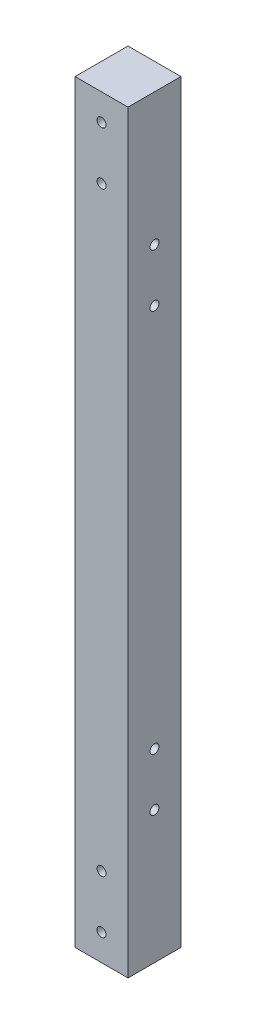
ISO-10303-21;
HEADER;
FILE_DESCRIPTION(('STEP AP214'),'2;1');
FILE_NAME('part.step','',(''),(''),'','','');
FILE_SCHEMA(('AUTOMOTIVE_DESIGN { 1 0 10303 214 1 1 1 1 }'));
ENDSEC;
DATA;
#1=APPLICATION_CONTEXT('core data for automotive mechanical design processes');
#2=APPLICATION_PROTOCOL_DEFINITION('international standard','automotive_design',2000,#1);
#3=PRODUCT_CONTEXT('',#1,'mechanical');
#4=PRODUCT('Part','Part','',(#3));
#5=PRODUCT_RELATED_PRODUCT_CATEGORY('part','',(#4));
#6=PRODUCT_DEFINITION_FORMATION('','',#4);
#7=PRODUCT_DEFINITION_CONTEXT('part definition',#1,'design');
#8=PRODUCT_DEFINITION('design','',#6,#7);
#9=PRODUCT_DEFINITION_SHAPE('','',#8);
#10=(LENGTH_UNIT() NAMED_UNIT(*) SI_UNIT(.MILLI.,.METRE.));
#11=(NAMED_UNIT(*) PLANE_ANGLE_UNIT() SI_UNIT($,.RADIAN.));
#12=(NAMED_UNIT(*) SI_UNIT($,.STERADIAN.) SOLID_ANGLE_UNIT());
#13=UNCERTAINTY_MEASURE_WITH_UNIT(LENGTH_MEASURE(1.E-05),#10,'distance_accuracy_value','');
#14=(GEOMETRIC_REPRESENTATION_CONTEXT(3) GLOBAL_UNCERTAINTY_ASSIGNED_CONTEXT((#13)) GLOBAL_UNIT_ASSIGNED_CONTEXT((#10,
#11,#12)) REPRESENTATION_CONTEXT('',''));
#15=CARTESIAN_POINT('',(0.,0.,0.));
#16=DIRECTION('',(0.,0.,1.));
#17=DIRECTION('',(1.,0.,0.));
#18=AXIS2_PLACEMENT_3D('',#15,#16,#17);
#19=CARTESIAN_POINT('',(0.,285.,0.));
#20=DIRECTION('',(1.,0.,0.));
#21=DIRECTION('',(0.,0.,-1.));
#22=AXIS2_PLACEMENT_3D('',#19,#20,#21);
#23=PLANE('',#22);
#24=CARTESIAN_POINT('',(0.,235.,-9.99999999999997));
#25=DIRECTION('',(1.,0.,0.));
#26=DIRECTION('',(0.,0.,-1.));
#27=AXIS2_PLACEMENT_3D('',#24,#25,#26);
#28=CIRCLE('',#27,1.7);
#29=CARTESIAN_POINT('',(0.,235.,-11.7));
#30=VERTEX_POINT('',#29);
#31=EDGE_CURVE('E204',#30,#30,#28,.T.);
#32=ORIENTED_EDGE('',*,*,#31,.T.);
#33=EDGE_LOOP('',(#32));
#34=FACE_BOUND('',#33,.T.);
#35=CARTESIAN_POINT('',(0.,70.,-9.99999999999999));
#36=DIRECTION('',(1.,0.,0.));
#37=DIRECTION('',(0.,0.,-1.));
#38=AXIS2_PLACEMENT_3D('',#35,#36,#37);
#39=CIRCLE('',#38,1.7);
#40=CARTESIAN_POINT('',(0.,70.,-11.7));
#41=VERTEX_POINT('',#40);
#42=EDGE_CURVE('E151',#41,#41,#39,.T.);
#43=ORIENTED_EDGE('',*,*,#42,.T.);
#44=EDGE_LOOP('',(#43));
#45=FACE_BOUND('',#44,.T.);
#46=CARTESIAN_POINT('',(0.,50.,-9.99999999999999));
#47=DIRECTION('',(1.,0.,0.));
#48=DIRECTION('',(0.,0.,-1.));
#49=AXIS2_PLACEMENT_3D('',#46,#47,#48);
#50=CIRCLE('',#49,1.7);
#51=CARTESIAN_POINT('',(0.,50.,-11.7));
#52=VERTEX_POINT('',#51);
#53=EDGE_CURVE('E157',#52,#52,#50,.T.);
#54=ORIENTED_EDGE('',*,*,#53,.T.);
#55=EDGE_LOOP('',(#54));
#56=FACE_BOUND('',#55,.T.);
#57=CARTESIAN_POINT('',(0.,215.,-9.99999999999997));
#58=DIRECTION('',(1.,0.,0.));
#59=DIRECTION('',(0.,0.,-1.));
#60=AXIS2_PLACEMENT_3D('',#57,#58,#59);
#61=CIRCLE('',#60,1.7);
#62=CARTESIAN_POINT('',(0.,215.,-11.7));
#63=VERTEX_POINT('',#62);
#64=EDGE_CURVE('E148',#63,#63,#61,.T.);
#65=ORIENTED_EDGE('',*,*,#64,.T.);
#66=EDGE_LOOP('',(#65));
#67=FACE_BOUND('',#66,.T.);
#68=DIRECTION('',(0.,0.,1.));
#69=VECTOR('',#68,1.);
#70=CARTESIAN_POINT('',(0.,0.,0.));
#71=LINE('',#70,#69);
#72=CARTESIAN_POINT('',(0.,0.,-20.));
#73=VERTEX_POINT('',#72);
#74=CARTESIAN_POINT('',(0.,0.,0.));
#75=VERTEX_POINT('',#74);
#76=EDGE_CURVE('E166',#73,#75,#71,.T.);
#77=ORIENTED_EDGE('',*,*,#76,.T.);
#78=DIRECTION('',(0.,-1.,0.));
#79=VECTOR('',#78,1.);
#80=CARTESIAN_POINT('',(0.,285.,0.));
#81=LINE('',#80,#79);
#82=CARTESIAN_POINT('',(0.,285.,0.));
#83=VERTEX_POINT('',#82);
#84=EDGE_CURVE('E12',#83,#75,#81,.T.);
#85=ORIENTED_EDGE('',*,*,#84,.F.);
#86=DIRECTION('',(0.,0.,1.));
#87=VECTOR('',#86,1.);
#88=CARTESIAN_POINT('',(0.,285.,0.));
#89=LINE('',#88,#87);
#90=CARTESIAN_POINT('',(0.,285.,-20.));
#91=VERTEX_POINT('',#90);
#92=EDGE_CURVE('E99',#91,#83,#89,.T.);
#93=ORIENTED_EDGE('',*,*,#92,.F.);
#94=DIRECTION('',(0.,-1.,0.));
#95=VECTOR('',#94,1.);
#96=CARTESIAN_POINT('',(0.,285.,-20.));
#97=LINE('',#96,#95);
#98=EDGE_CURVE('E115',#91,#73,#97,.T.);
#99=ORIENTED_EDGE('',*,*,#98,.T.);
#100=EDGE_LOOP('',(#77,#85,#93,#99));
#101=FACE_BOUND('',#100,.T.);
#102=ADVANCED_FACE('F50',(#34,#45,#56,#67,#101),#23,.F.);
#103=CARTESIAN_POINT('',(0.,285.,0.));
#104=DIRECTION('',(0.,0.,-1.));
#105=DIRECTION('',(-1.,0.,0.));
#106=AXIS2_PLACEMENT_3D('',#103,#104,#105);
#107=PLANE('',#106);
#108=CARTESIAN_POINT('',(9.99999999999997,275.,0.));
#109=DIRECTION('',(0.,0.,1.));
#110=DIRECTION('',(1.,0.,0.));
#111=AXIS2_PLACEMENT_3D('',#108,#109,#110);
#112=CIRCLE('',#111,1.69999999999999);
#113=CARTESIAN_POINT('',(11.7,275.,0.));
#114=VERTEX_POINT('',#113);
#115=EDGE_CURVE('E169',#114,#114,#112,.T.);
#116=ORIENTED_EDGE('',*,*,#115,.F.);
#117=EDGE_LOOP('',(#116));
#118=FACE_BOUND('',#117,.T.);
#119=CARTESIAN_POINT('',(9.99999999999997,255.,0.));
#120=DIRECTION('',(0.,0.,1.));
#121=DIRECTION('',(1.,0.,0.));
#122=AXIS2_PLACEMENT_3D('',#119,#120,#121);
#123=CIRCLE('',#122,1.69999999999999);
#124=CARTESIAN_POINT('',(11.7,255.,0.));
#125=VERTEX_POINT('',#124);
#126=EDGE_CURVE('E172',#125,#125,#123,.T.);
#127=ORIENTED_EDGE('',*,*,#126,.F.);
#128=EDGE_LOOP('',(#127));
#129=FACE_BOUND('',#128,.T.);
#130=CARTESIAN_POINT('',(9.99999999999999,30.,0.));
#131=DIRECTION('',(0.,0.,1.));
#132=DIRECTION('',(1.,0.,0.));
#133=AXIS2_PLACEMENT_3D('',#130,#131,#132);
#134=CIRCLE('',#133,1.7);
#135=CARTESIAN_POINT('',(11.7,30.,0.));
#136=VERTEX_POINT('',#135);
#137=EDGE_CURVE('E184',#136,#136,#134,.T.);
#138=ORIENTED_EDGE('',*,*,#137,.F.);
#139=EDGE_LOOP('',(#138));
#140=FACE_BOUND('',#139,.T.);
#141=CARTESIAN_POINT('',(10.,10.,0.));
#142=DIRECTION('',(0.,0.,1.));
#143=DIRECTION('',(1.,0.,0.));
#144=AXIS2_PLACEMENT_3D('',#141,#142,#143);
#145=CIRCLE('',#144,1.7);
#146=CARTESIAN_POINT('',(11.7,10.,0.));
#147=VERTEX_POINT('',#146);
#148=EDGE_CURVE('E194',#147,#147,#145,.T.);
#149=ORIENTED_EDGE('',*,*,#148,.F.);
#150=EDGE_LOOP('',(#149));
#151=FACE_BOUND('',#150,.T.);
#152=DIRECTION('',(1.,0.,0.));
#153=VECTOR('',#152,1.);
#154=CARTESIAN_POINT('',(0.,0.,0.));
#155=LINE('',#154,#153);
#156=CARTESIAN_POINT('',(20.,0.,0.));
#157=VERTEX_POINT('',#156);
#158=EDGE_CURVE('E102',#75,#157,#155,.T.);
#159=ORIENTED_EDGE('',*,*,#158,.T.);
#160=DIRECTION('',(0.,-1.,0.));
#161=VECTOR('',#160,1.);
#162=CARTESIAN_POINT('',(20.,285.,0.));
#163=LINE('',#162,#161);
#164=CARTESIAN_POINT('',(20.,285.,0.));
#165=VERTEX_POINT('',#164);
#166=EDGE_CURVE('E60',#165,#157,#163,.T.);
#167=ORIENTED_EDGE('',*,*,#166,.F.);
#168=DIRECTION('',(1.,0.,0.));
#169=VECTOR('',#168,1.);
#170=CARTESIAN_POINT('',(0.,285.,0.));
#171=LINE('',#170,#169);
#172=EDGE_CURVE('E92',#83,#165,#171,.T.);
#173=ORIENTED_EDGE('',*,*,#172,.F.);
#174=ORIENTED_EDGE('',*,*,#84,.T.);
#175=EDGE_LOOP('',(#159,#167,#173,#174));
#176=FACE_BOUND('',#175,.T.);
#177=ADVANCED_FACE('F104',(#118,#129,#140,#151,#176),#107,.F.);
#178=CARTESIAN_POINT('',(20.,285.,0.));
#179=DIRECTION('',(-1.,0.,0.));
#180=DIRECTION('',(0.,0.,1.));
#181=AXIS2_PLACEMENT_3D('',#178,#179,#180);
#182=PLANE('',#181);
#183=CARTESIAN_POINT('',(20.,235.,-9.99999999999997));
#184=DIRECTION('',(1.,0.,0.));
#185=DIRECTION('',(0.,0.,-1.));
#186=AXIS2_PLACEMENT_3D('',#183,#184,#185);
#187=CIRCLE('',#186,1.7);
#188=CARTESIAN_POINT('',(20.,235.,-11.7));
#189=VERTEX_POINT('',#188);
#190=EDGE_CURVE('E146',#189,#189,#187,.T.);
#191=ORIENTED_EDGE('',*,*,#190,.F.);
#192=EDGE_LOOP('',(#191));
#193=FACE_BOUND('',#192,.T.);
#194=CARTESIAN_POINT('',(20.,70.,-9.99999999999999));
#195=DIRECTION('',(1.,0.,0.));
#196=DIRECTION('',(0.,0.,-1.));
#197=AXIS2_PLACEMENT_3D('',#194,#195,#196);
#198=CIRCLE('',#197,1.7);
#199=CARTESIAN_POINT('',(20.,70.,-11.7));
#200=VERTEX_POINT('',#199);
#201=EDGE_CURVE('E165',#200,#200,#198,.T.);
#202=ORIENTED_EDGE('',*,*,#201,.F.);
#203=EDGE_LOOP('',(#202));
#204=FACE_BOUND('',#203,.T.);
#205=CARTESIAN_POINT('',(20.,50.,-9.99999999999999));
#206=DIRECTION('',(1.,0.,0.));
#207=DIRECTION('',(0.,0.,-1.));
#208=AXIS2_PLACEMENT_3D('',#205,#206,#207);
#209=CIRCLE('',#208,1.7);
#210=CARTESIAN_POINT('',(20.,50.,-11.7));
#211=VERTEX_POINT('',#210);
#212=EDGE_CURVE('E154',#211,#211,#209,.T.);
#213=ORIENTED_EDGE('',*,*,#212,.F.);
#214=EDGE_LOOP('',(#213));
#215=FACE_BOUND('',#214,.T.);
#216=CARTESIAN_POINT('',(20.,215.,-9.99999999999997));
#217=DIRECTION('',(1.,0.,0.));
#218=DIRECTION('',(0.,0.,-1.));
#219=AXIS2_PLACEMENT_3D('',#216,#217,#218);
#220=CIRCLE('',#219,1.7);
#221=CARTESIAN_POINT('',(20.,215.,-11.7));
#222=VERTEX_POINT('',#221);
#223=EDGE_CURVE('E141',#222,#222,#220,.T.);
#224=ORIENTED_EDGE('',*,*,#223,.F.);
#225=EDGE_LOOP('',(#224));
#226=FACE_BOUND('',#225,.T.);
#227=DIRECTION('',(0.,0.,-1.));
#228=VECTOR('',#227,1.);
#229=CARTESIAN_POINT('',(20.,0.,0.));
#230=LINE('',#229,#228);
#231=CARTESIAN_POINT('',(20.,0.,-20.));
#232=VERTEX_POINT('',#231);
#233=EDGE_CURVE('E85',#157,#232,#230,.T.);
#234=ORIENTED_EDGE('',*,*,#233,.T.);
#235=DIRECTION('',(0.,-1.,0.));
#236=VECTOR('',#235,1.);
#237=CARTESIAN_POINT('',(20.,285.,-20.));
#238=LINE('',#237,#236);
#239=CARTESIAN_POINT('',(20.,285.,-20.));
#240=VERTEX_POINT('',#239);
#241=EDGE_CURVE('E110',#240,#232,#238,.T.);
#242=ORIENTED_EDGE('',*,*,#241,.F.);
#243=DIRECTION('',(0.,0.,-1.));
#244=VECTOR('',#243,1.);
#245=CARTESIAN_POINT('',(20.,285.,0.));
#246=LINE('',#245,#244);
#247=EDGE_CURVE('E96',#165,#240,#246,.T.);
#248=ORIENTED_EDGE('',*,*,#247,.F.);
#249=ORIENTED_EDGE('',*,*,#166,.T.);
#250=EDGE_LOOP('',(#234,#242,#248,#249));
#251=FACE_BOUND('',#250,.T.);
#252=ADVANCED_FACE('F108',(#193,#204,#215,#226,#251),#182,.F.);
#253=CARTESIAN_POINT('',(0.,285.,-20.));
#254=DIRECTION('',(0.,0.,1.));
#255=DIRECTION('',(1.,0.,0.));
#256=AXIS2_PLACEMENT_3D('',#253,#254,#255);
#257=PLANE('',#256);
#258=CARTESIAN_POINT('',(9.99999999999997,275.,-20.));
#259=DIRECTION('',(0.,0.,1.));
#260=DIRECTION('',(1.,0.,0.));
#261=AXIS2_PLACEMENT_3D('',#258,#259,#260);
#262=CIRCLE('',#261,1.69999999999999);
#263=CARTESIAN_POINT('',(11.7,275.,-20.));
#264=VERTEX_POINT('',#263);
#265=EDGE_CURVE('E164',#264,#264,#262,.T.);
#266=ORIENTED_EDGE('',*,*,#265,.T.);
#267=EDGE_LOOP('',(#266));
#268=FACE_BOUND('',#267,.T.);
#269=CARTESIAN_POINT('',(9.99999999999997,255.,-20.));
#270=DIRECTION('',(0.,0.,1.));
#271=DIRECTION('',(1.,0.,0.));
#272=AXIS2_PLACEMENT_3D('',#269,#270,#271);
#273=CIRCLE('',#272,1.69999999999999);
#274=CARTESIAN_POINT('',(11.7,255.,-20.));
#275=VERTEX_POINT('',#274);
#276=EDGE_CURVE('E177',#275,#275,#273,.T.);
#277=ORIENTED_EDGE('',*,*,#276,.T.);
#278=EDGE_LOOP('',(#277));
#279=FACE_BOUND('',#278,.T.);
#280=CARTESIAN_POINT('',(9.99999999999999,30.,-20.));
#281=DIRECTION('',(0.,0.,1.));
#282=DIRECTION('',(1.,0.,0.));
#283=AXIS2_PLACEMENT_3D('',#280,#281,#282);
#284=CIRCLE('',#283,1.7);
#285=CARTESIAN_POINT('',(11.7,30.,-20.));
#286=VERTEX_POINT('',#285);
#287=EDGE_CURVE('E188',#286,#286,#284,.T.);
#288=ORIENTED_EDGE('',*,*,#287,.T.);
#289=EDGE_LOOP('',(#288));
#290=FACE_BOUND('',#289,.T.);
#291=CARTESIAN_POINT('',(10.,10.,-20.));
#292=DIRECTION('',(0.,0.,1.));
#293=DIRECTION('',(1.,0.,0.));
#294=AXIS2_PLACEMENT_3D('',#291,#292,#293);
#295=CIRCLE('',#294,1.7);
#296=CARTESIAN_POINT('',(11.7,10.,-20.));
#297=VERTEX_POINT('',#296);
#298=EDGE_CURVE('E197',#297,#297,#295,.T.);
#299=ORIENTED_EDGE('',*,*,#298,.T.);
#300=EDGE_LOOP('',(#299));
#301=FACE_BOUND('',#300,.T.);
#302=DIRECTION('',(-1.,0.,0.));
#303=VECTOR('',#302,1.);
#304=CARTESIAN_POINT('',(0.,0.,-20.));
#305=LINE('',#304,#303);
#306=EDGE_CURVE('E87',#232,#73,#305,.T.);
#307=ORIENTED_EDGE('',*,*,#306,.T.);
#308=ORIENTED_EDGE('',*,*,#98,.F.);
#309=DIRECTION('',(-1.,0.,0.));
#310=VECTOR('',#309,1.);
#311=CARTESIAN_POINT('',(0.,285.,-20.));
#312=LINE('',#311,#310);
#313=EDGE_CURVE('E63',#240,#91,#312,.T.);
#314=ORIENTED_EDGE('',*,*,#313,.F.);
#315=ORIENTED_EDGE('',*,*,#241,.T.);
#316=EDGE_LOOP('',(#307,#308,#314,#315));
#317=FACE_BOUND('',#316,.T.);
#318=ADVANCED_FACE('F235',(#268,#279,#290,#301,#317),#257,.F.);
#319=CARTESIAN_POINT('',(0.,285.,0.));
#320=DIRECTION('',(0.,-1.,0.));
#321=DIRECTION('',(0.,0.,-1.));
#322=AXIS2_PLACEMENT_3D('',#319,#320,#321);
#323=PLANE('',#322);
#324=ORIENTED_EDGE('',*,*,#92,.T.);
#325=ORIENTED_EDGE('',*,*,#172,.T.);
#326=ORIENTED_EDGE('',*,*,#247,.T.);
#327=ORIENTED_EDGE('',*,*,#313,.T.);
#328=EDGE_LOOP('',(#324,#325,#326,#327));
#329=FACE_BOUND('',#328,.T.);
#330=ADVANCED_FACE('F98',(#329),#323,.F.);
#331=CARTESIAN_POINT('',(0.,0.,0.));
#332=DIRECTION('',(0.,-1.,0.));
#333=DIRECTION('',(0.,0.,-1.));
#334=AXIS2_PLACEMENT_3D('',#331,#332,#333);
#335=PLANE('',#334);
#336=ORIENTED_EDGE('',*,*,#76,.F.);
#337=ORIENTED_EDGE('',*,*,#306,.F.);
#338=ORIENTED_EDGE('',*,*,#233,.F.);
#339=ORIENTED_EDGE('',*,*,#158,.F.);
#340=EDGE_LOOP('',(#336,#337,#338,#339));
#341=FACE_BOUND('',#340,.T.);
#342=ADVANCED_FACE('F319',(#341),#335,.T.);
#343=CARTESIAN_POINT('',(10.,10.,-20.));
#344=DIRECTION('',(0.,0.,1.));
#345=DIRECTION('',(1.,0.,0.));
#346=AXIS2_PLACEMENT_3D('',#343,#344,#345);
#347=CYLINDRICAL_SURFACE('',#346,1.7);
#348=ORIENTED_EDGE('',*,*,#298,.F.);
#349=EDGE_LOOP('',(#348));
#350=FACE_BOUND('',#349,.T.);
#351=ORIENTED_EDGE('',*,*,#148,.T.);
#352=EDGE_LOOP('',(#351));
#353=FACE_BOUND('',#352,.T.);
#354=ADVANCED_FACE('F308',(#350,#353),#347,.F.);
#355=CARTESIAN_POINT('',(9.99999999999999,30.,-20.));
#356=DIRECTION('',(0.,0.,1.));
#357=DIRECTION('',(1.,0.,0.));
#358=AXIS2_PLACEMENT_3D('',#355,#356,#357);
#359=CYLINDRICAL_SURFACE('',#358,1.7);
#360=ORIENTED_EDGE('',*,*,#287,.F.);
#361=EDGE_LOOP('',(#360));
#362=FACE_BOUND('',#361,.T.);
#363=ORIENTED_EDGE('',*,*,#137,.T.);
#364=EDGE_LOOP('',(#363));
#365=FACE_BOUND('',#364,.T.);
#366=ADVANCED_FACE('F296',(#362,#365),#359,.F.);
#367=CARTESIAN_POINT('',(9.99999999999997,255.,-20.));
#368=DIRECTION('',(0.,0.,1.));
#369=DIRECTION('',(1.,0.,0.));
#370=AXIS2_PLACEMENT_3D('',#367,#368,#369);
#371=CYLINDRICAL_SURFACE('',#370,1.69999999999999);
#372=ORIENTED_EDGE('',*,*,#276,.F.);
#373=EDGE_LOOP('',(#372));
#374=FACE_BOUND('',#373,.T.);
#375=ORIENTED_EDGE('',*,*,#126,.T.);
#376=EDGE_LOOP('',(#375));
#377=FACE_BOUND('',#376,.T.);
#378=ADVANCED_FACE('F249',(#374,#377),#371,.F.);
#379=CARTESIAN_POINT('',(9.99999999999997,275.,-20.));
#380=DIRECTION('',(0.,0.,1.));
#381=DIRECTION('',(1.,0.,0.));
#382=AXIS2_PLACEMENT_3D('',#379,#380,#381);
#383=CYLINDRICAL_SURFACE('',#382,1.69999999999999);
#384=ORIENTED_EDGE('',*,*,#265,.F.);
#385=EDGE_LOOP('',(#384));
#386=FACE_BOUND('',#385,.T.);
#387=ORIENTED_EDGE('',*,*,#115,.T.);
#388=EDGE_LOOP('',(#387));
#389=FACE_BOUND('',#388,.T.);
#390=ADVANCED_FACE('F241',(#386,#389),#383,.F.);
#391=CARTESIAN_POINT('',(0.,215.,-9.99999999999997));
#392=DIRECTION('',(1.,0.,0.));
#393=DIRECTION('',(0.,0.,-1.));
#394=AXIS2_PLACEMENT_3D('',#391,#392,#393);
#395=CYLINDRICAL_SURFACE('',#394,1.7);
#396=ORIENTED_EDGE('',*,*,#64,.F.);
#397=EDGE_LOOP('',(#396));
#398=FACE_BOUND('',#397,.T.);
#399=ORIENTED_EDGE('',*,*,#223,.T.);
#400=EDGE_LOOP('',(#399));
#401=FACE_BOUND('',#400,.T.);
#402=ADVANCED_FACE('F237',(#398,#401),#395,.F.);
#403=CARTESIAN_POINT('',(0.,50.,-9.99999999999999));
#404=DIRECTION('',(1.,0.,0.));
#405=DIRECTION('',(0.,0.,-1.));
#406=AXIS2_PLACEMENT_3D('',#403,#404,#405);
#407=CYLINDRICAL_SURFACE('',#406,1.7);
#408=ORIENTED_EDGE('',*,*,#53,.F.);
#409=EDGE_LOOP('',(#408));
#410=FACE_BOUND('',#409,.T.);
#411=ORIENTED_EDGE('',*,*,#212,.T.);
#412=EDGE_LOOP('',(#411));
#413=FACE_BOUND('',#412,.T.);
#414=ADVANCED_FACE('F228',(#410,#413),#407,.F.);
#415=CARTESIAN_POINT('',(0.,70.,-9.99999999999999));
#416=DIRECTION('',(1.,0.,0.));
#417=DIRECTION('',(0.,0.,-1.));
#418=AXIS2_PLACEMENT_3D('',#415,#416,#417);
#419=CYLINDRICAL_SURFACE('',#418,1.7);
#420=ORIENTED_EDGE('',*,*,#42,.F.);
#421=EDGE_LOOP('',(#420));
#422=FACE_BOUND('',#421,.T.);
#423=ORIENTED_EDGE('',*,*,#201,.T.);
#424=EDGE_LOOP('',(#423));
#425=FACE_BOUND('',#424,.T.);
#426=ADVANCED_FACE('F221',(#422,#425),#419,.F.);
#427=CARTESIAN_POINT('',(0.,235.,-9.99999999999997));
#428=DIRECTION('',(1.,0.,0.));
#429=DIRECTION('',(0.,0.,-1.));
#430=AXIS2_PLACEMENT_3D('',#427,#428,#429);
#431=CYLINDRICAL_SURFACE('',#430,1.7);
#432=ORIENTED_EDGE('',*,*,#31,.F.);
#433=EDGE_LOOP('',(#432));
#434=FACE_BOUND('',#433,.T.);
#435=ORIENTED_EDGE('',*,*,#190,.T.);
#436=EDGE_LOOP('',(#435));
#437=FACE_BOUND('',#436,.T.);
#438=ADVANCED_FACE('F222',(#434,#437),#431,.F.);
#439=CLOSED_SHELL('',(#102,#177,#252,#318,#330,#342,#354,#366,#378,#390,#402,#414,#426,#438));
#440=MANIFOLD_SOLID_BREP('B2',#439);
#441=ADVANCED_BREP_SHAPE_REPRESENTATION('',(#18,#440),#14);
#442=SHAPE_DEFINITION_REPRESENTATION(#9,#441);
ENDSEC;
END-ISO-10303-21;
